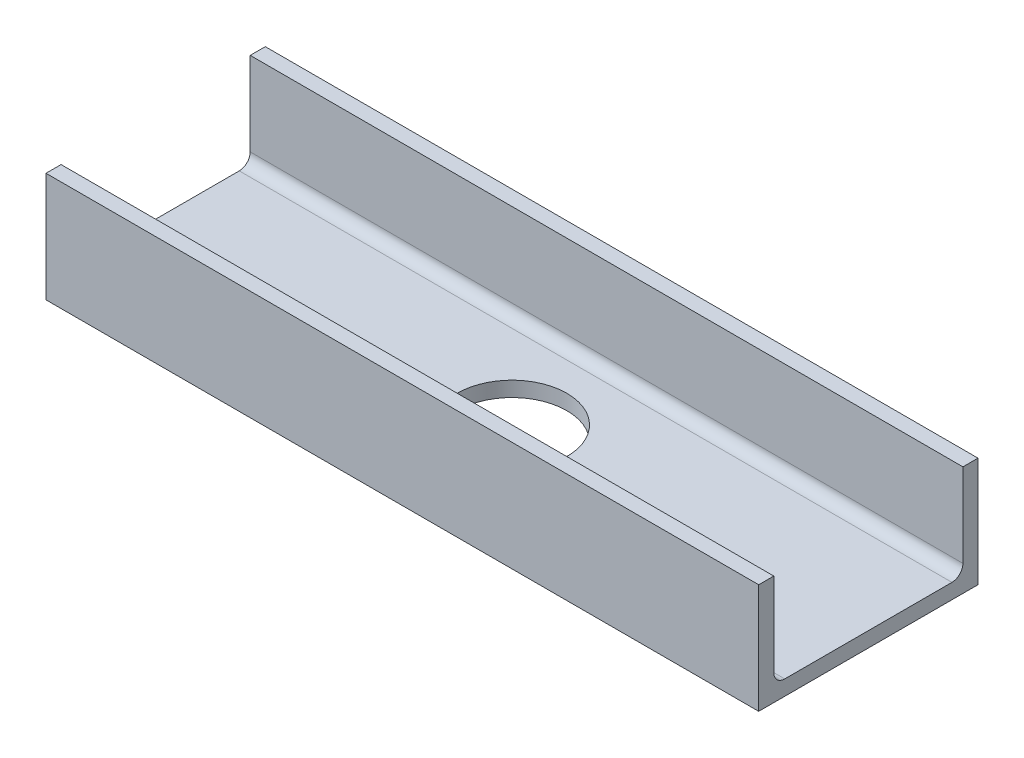
ISO-10303-21;
HEADER;
FILE_DESCRIPTION(('STEP AP214'),'2;1');
FILE_NAME('part.step','',(''),(''),'','','');
FILE_SCHEMA(('AUTOMOTIVE_DESIGN { 1 0 10303 214 1 1 1 1 }'));
ENDSEC;
DATA;
#1=APPLICATION_CONTEXT('core data for automotive mechanical design processes');
#2=APPLICATION_PROTOCOL_DEFINITION('international standard','automotive_design',2000,#1);
#3=PRODUCT_CONTEXT('',#1,'mechanical');
#4=PRODUCT('Part','Part','',(#3));
#5=PRODUCT_RELATED_PRODUCT_CATEGORY('part','',(#4));
#6=PRODUCT_DEFINITION_FORMATION('','',#4);
#7=PRODUCT_DEFINITION_CONTEXT('part definition',#1,'design');
#8=PRODUCT_DEFINITION('design','',#6,#7);
#9=PRODUCT_DEFINITION_SHAPE('','',#8);
#10=(LENGTH_UNIT() NAMED_UNIT(*) SI_UNIT(.MILLI.,.METRE.));
#11=(NAMED_UNIT(*) PLANE_ANGLE_UNIT() SI_UNIT($,.RADIAN.));
#12=(NAMED_UNIT(*) SI_UNIT($,.STERADIAN.) SOLID_ANGLE_UNIT());
#13=UNCERTAINTY_MEASURE_WITH_UNIT(LENGTH_MEASURE(1.E-05),#10,'distance_accuracy_value','');
#14=(GEOMETRIC_REPRESENTATION_CONTEXT(3) GLOBAL_UNCERTAINTY_ASSIGNED_CONTEXT((#13)) GLOBAL_UNIT_ASSIGNED_CONTEXT((#10,
#11,#12)) REPRESENTATION_CONTEXT('',''));
#15=CARTESIAN_POINT('',(0.,0.,0.));
#16=DIRECTION('',(0.,0.,1.));
#17=DIRECTION('',(1.,0.,0.));
#18=AXIS2_PLACEMENT_3D('',#15,#16,#17);
#19=CARTESIAN_POINT('',(-165.1,-9.2075,0.));
#20=DIRECTION('',(0.,-1.,0.));
#21=DIRECTION('',(0.,0.,-1.));
#22=AXIS2_PLACEMENT_3D('',#19,#20,#21);
#23=PLANE('',#22);
#24=CARTESIAN_POINT('',(-82.55,-9.2075,-4.07997203730193E-11));
#25=DIRECTION('',(0.,-1.,0.));
#26=DIRECTION('',(0.,0.,-1.));
#27=AXIS2_PLACEMENT_3D('',#24,#25,#26);
#28=CIRCLE('',#27,12.7);
#29=CARTESIAN_POINT('',(-82.55,-9.2075,-12.7000000000408));
#30=VERTEX_POINT('',#29);
#31=EDGE_CURVE('E160',#30,#30,#28,.T.);
#32=ORIENTED_EDGE('',*,*,#31,.T.);
#33=EDGE_LOOP('',(#32));
#34=FACE_BOUND('',#33,.T.);
#35=DIRECTION('',(0.,0.,-1.));
#36=VECTOR('',#35,1.);
#37=CARTESIAN_POINT('',(0.,-9.2075,0.));
#38=LINE('',#37,#36);
#39=CARTESIAN_POINT('',(0.,-9.2075,19.3675));
#40=VERTEX_POINT('',#39);
#41=CARTESIAN_POINT('',(0.,-9.2075,-19.3675));
#42=VERTEX_POINT('',#41);
#43=EDGE_CURVE('E163',#40,#42,#38,.T.);
#44=ORIENTED_EDGE('',*,*,#43,.T.);
#45=DIRECTION('',(1.,0.,0.));
#46=VECTOR('',#45,1.);
#47=CARTESIAN_POINT('',(-165.1,-9.2075,-19.3675));
#48=LINE('',#47,#46);
#49=CARTESIAN_POINT('',(-165.1,-9.2075,-19.3675));
#50=VERTEX_POINT('',#49);
#51=EDGE_CURVE('E11',#50,#42,#48,.T.);
#52=ORIENTED_EDGE('',*,*,#51,.F.);
#53=DIRECTION('',(0.,0.,-1.));
#54=VECTOR('',#53,1.);
#55=CARTESIAN_POINT('',(-165.1,-9.2075,0.));
#56=LINE('',#55,#54);
#57=CARTESIAN_POINT('',(-165.1,-9.2075,19.3675));
#58=VERTEX_POINT('',#57);
#59=EDGE_CURVE('E57',#58,#50,#56,.T.);
#60=ORIENTED_EDGE('',*,*,#59,.F.);
#61=DIRECTION('',(1.,0.,0.));
#62=VECTOR('',#61,1.);
#63=CARTESIAN_POINT('',(-165.1,-9.2075,19.3675));
#64=LINE('',#63,#62);
#65=EDGE_CURVE('E42',#58,#40,#64,.T.);
#66=ORIENTED_EDGE('',*,*,#65,.T.);
#67=EDGE_LOOP('',(#44,#52,#60,#66));
#68=FACE_BOUND('',#67,.T.);
#69=ADVANCED_FACE('F39',(#34,#68),#23,.F.);
#70=CARTESIAN_POINT('',(-165.1,-6.6675,-19.3675));
#71=DIRECTION('',(1.,0.,0.));
#72=DIRECTION('',(0.,0.,-1.));
#73=AXIS2_PLACEMENT_3D('',#70,#71,#72);
#74=CYLINDRICAL_SURFACE('',#73,2.54);
#75=CARTESIAN_POINT('',(0.,-6.6675,-19.3675));
#76=DIRECTION('',(1.,0.,0.));
#77=DIRECTION('',(0.,0.,-1.));
#78=AXIS2_PLACEMENT_3D('',#75,#76,#77);
#79=CIRCLE('',#78,2.54);
#80=CARTESIAN_POINT('',(0.,-6.6675,-21.9075));
#81=VERTEX_POINT('',#80);
#82=EDGE_CURVE('E159',#81,#42,#79,.F.);
#83=ORIENTED_EDGE('',*,*,#82,.F.);
#84=DIRECTION('',(1.,0.,0.));
#85=VECTOR('',#84,1.);
#86=CARTESIAN_POINT('',(-165.1,-6.6675,-21.9075));
#87=LINE('',#86,#85);
#88=CARTESIAN_POINT('',(-165.1,-6.6675,-21.9075));
#89=VERTEX_POINT('',#88);
#90=EDGE_CURVE('E48',#89,#81,#87,.T.);
#91=ORIENTED_EDGE('',*,*,#90,.F.);
#92=CARTESIAN_POINT('',(-165.1,-6.6675,-19.3675));
#93=DIRECTION('',(1.,0.,0.));
#94=DIRECTION('',(0.,0.,-1.));
#95=AXIS2_PLACEMENT_3D('',#92,#93,#94);
#96=CIRCLE('',#95,2.54);
#97=EDGE_CURVE('E128',#89,#50,#96,.F.);
#98=ORIENTED_EDGE('',*,*,#97,.T.);
#99=ORIENTED_EDGE('',*,*,#51,.T.);
#100=EDGE_LOOP('',(#83,#91,#98,#99));
#101=FACE_BOUND('',#100,.T.);
#102=ADVANCED_FACE('F240',(#101),#74,.F.);
#103=CARTESIAN_POINT('',(-165.1,0.,-21.9075));
#104=DIRECTION('',(0.,0.,-1.));
#105=DIRECTION('',(-1.,0.,0.));
#106=AXIS2_PLACEMENT_3D('',#103,#104,#105);
#107=PLANE('',#106);
#108=DIRECTION('',(0.,1.,0.));
#109=VECTOR('',#108,1.);
#110=CARTESIAN_POINT('',(0.,0.,-21.9075));
#111=LINE('',#110,#109);
#112=CARTESIAN_POINT('',(0.,12.7,-21.9075));
#113=VERTEX_POINT('',#112);
#114=EDGE_CURVE('E133',#81,#113,#111,.T.);
#115=ORIENTED_EDGE('',*,*,#114,.T.);
#116=DIRECTION('',(1.,0.,0.));
#117=VECTOR('',#116,1.);
#118=CARTESIAN_POINT('',(-165.1,12.7,-21.9075));
#119=LINE('',#118,#117);
#120=CARTESIAN_POINT('',(-165.1,12.7,-21.9075));
#121=VERTEX_POINT('',#120);
#122=EDGE_CURVE('E131',#121,#113,#119,.T.);
#123=ORIENTED_EDGE('',*,*,#122,.F.);
#124=DIRECTION('',(0.,1.,0.));
#125=VECTOR('',#124,1.);
#126=CARTESIAN_POINT('',(-165.1,0.,-21.9075));
#127=LINE('',#126,#125);
#128=EDGE_CURVE('E121',#89,#121,#127,.T.);
#129=ORIENTED_EDGE('',*,*,#128,.F.);
#130=ORIENTED_EDGE('',*,*,#90,.T.);
#131=EDGE_LOOP('',(#115,#123,#129,#130));
#132=FACE_BOUND('',#131,.T.);
#133=ADVANCED_FACE('F132',(#132),#107,.F.);
#134=CARTESIAN_POINT('',(-165.1,12.7,0.));
#135=DIRECTION('',(0.,-1.,0.));
#136=DIRECTION('',(0.,0.,-1.));
#137=AXIS2_PLACEMENT_3D('',#134,#135,#136);
#138=PLANE('',#137);
#139=DIRECTION('',(0.,0.,-1.));
#140=VECTOR('',#139,1.);
#141=CARTESIAN_POINT('',(0.,12.7,0.));
#142=LINE('',#141,#140);
#143=CARTESIAN_POINT('',(0.,12.7,-25.4));
#144=VERTEX_POINT('',#143);
#145=EDGE_CURVE('E191',#113,#144,#142,.T.);
#146=ORIENTED_EDGE('',*,*,#145,.T.);
#147=DIRECTION('',(1.,0.,0.));
#148=VECTOR('',#147,1.);
#149=CARTESIAN_POINT('',(-165.1,12.7,-25.4));
#150=LINE('',#149,#148);
#151=CARTESIAN_POINT('',(-165.1,12.7,-25.4));
#152=VERTEX_POINT('',#151);
#153=EDGE_CURVE('E137',#152,#144,#150,.T.);
#154=ORIENTED_EDGE('',*,*,#153,.F.);
#155=DIRECTION('',(0.,0.,-1.));
#156=VECTOR('',#155,1.);
#157=CARTESIAN_POINT('',(-165.1,12.7,0.));
#158=LINE('',#157,#156);
#159=EDGE_CURVE('E126',#121,#152,#158,.T.);
#160=ORIENTED_EDGE('',*,*,#159,.F.);
#161=ORIENTED_EDGE('',*,*,#122,.T.);
#162=EDGE_LOOP('',(#146,#154,#160,#161));
#163=FACE_BOUND('',#162,.T.);
#164=ADVANCED_FACE('F139',(#163),#138,.F.);
#165=CARTESIAN_POINT('',(-165.1,0.,-25.4));
#166=DIRECTION('',(0.,0.,-1.));
#167=DIRECTION('',(-1.,0.,0.));
#168=AXIS2_PLACEMENT_3D('',#165,#166,#167);
#169=PLANE('',#168);
#170=DIRECTION('',(0.,1.,0.));
#171=VECTOR('',#170,1.);
#172=CARTESIAN_POINT('',(0.,0.,-25.4));
#173=LINE('',#172,#171);
#174=CARTESIAN_POINT('',(0.,-12.7,-25.4));
#175=VERTEX_POINT('',#174);
#176=EDGE_CURVE('E188',#175,#144,#173,.T.);
#177=ORIENTED_EDGE('',*,*,#176,.F.);
#178=DIRECTION('',(1.,0.,0.));
#179=VECTOR('',#178,1.);
#180=CARTESIAN_POINT('',(-165.1,-12.7,-25.4));
#181=LINE('',#180,#179);
#182=CARTESIAN_POINT('',(-165.1,-12.7,-25.4));
#183=VERTEX_POINT('',#182);
#184=EDGE_CURVE('E183',#183,#175,#181,.T.);
#185=ORIENTED_EDGE('',*,*,#184,.F.);
#186=DIRECTION('',(0.,1.,0.));
#187=VECTOR('',#186,1.);
#188=CARTESIAN_POINT('',(-165.1,0.,-25.4));
#189=LINE('',#188,#187);
#190=EDGE_CURVE('E141',#183,#152,#189,.T.);
#191=ORIENTED_EDGE('',*,*,#190,.T.);
#192=ORIENTED_EDGE('',*,*,#153,.T.);
#193=EDGE_LOOP('',(#177,#185,#191,#192));
#194=FACE_BOUND('',#193,.T.);
#195=ADVANCED_FACE('F175',(#194),#169,.T.);
#196=CARTESIAN_POINT('',(-165.1,-12.7,0.));
#197=DIRECTION('',(0.,-1.,0.));
#198=DIRECTION('',(0.,0.,-1.));
#199=AXIS2_PLACEMENT_3D('',#196,#197,#198);
#200=PLANE('',#199);
#201=CARTESIAN_POINT('',(-82.55,-12.7,-4.07997203730193E-11));
#202=DIRECTION('',(0.,-1.,0.));
#203=DIRECTION('',(0.,0.,-1.));
#204=AXIS2_PLACEMENT_3D('',#201,#202,#203);
#205=CIRCLE('',#204,12.7);
#206=CARTESIAN_POINT('',(-82.55,-12.7,-12.7000000000408));
#207=VERTEX_POINT('',#206);
#208=EDGE_CURVE('E164',#207,#207,#205,.T.);
#209=ORIENTED_EDGE('',*,*,#208,.F.);
#210=EDGE_LOOP('',(#209));
#211=FACE_BOUND('',#210,.T.);
#212=DIRECTION('',(0.,0.,-1.));
#213=VECTOR('',#212,1.);
#214=CARTESIAN_POINT('',(0.,-12.7,0.));
#215=LINE('',#214,#213);
#216=CARTESIAN_POINT('',(0.,-12.7,25.4));
#217=VERTEX_POINT('',#216);
#218=EDGE_CURVE('E179',#217,#175,#215,.T.);
#219=ORIENTED_EDGE('',*,*,#218,.F.);
#220=DIRECTION('',(1.,0.,0.));
#221=VECTOR('',#220,1.);
#222=CARTESIAN_POINT('',(-165.1,-12.7,25.4));
#223=LINE('',#222,#221);
#224=CARTESIAN_POINT('',(-165.1,-12.7,25.4));
#225=VERTEX_POINT('',#224);
#226=EDGE_CURVE('E181',#225,#217,#223,.T.);
#227=ORIENTED_EDGE('',*,*,#226,.F.);
#228=DIRECTION('',(0.,0.,-1.));
#229=VECTOR('',#228,1.);
#230=CARTESIAN_POINT('',(-165.1,-12.7,0.));
#231=LINE('',#230,#229);
#232=EDGE_CURVE('E144',#225,#183,#231,.T.);
#233=ORIENTED_EDGE('',*,*,#232,.T.);
#234=ORIENTED_EDGE('',*,*,#184,.T.);
#235=EDGE_LOOP('',(#219,#227,#233,#234));
#236=FACE_BOUND('',#235,.T.);
#237=ADVANCED_FACE('F171',(#211,#236),#200,.T.);
#238=CARTESIAN_POINT('',(-165.1,0.,25.4));
#239=DIRECTION('',(0.,0.,-1.));
#240=DIRECTION('',(-1.,0.,0.));
#241=AXIS2_PLACEMENT_3D('',#238,#239,#240);
#242=PLANE('',#241);
#243=DIRECTION('',(0.,1.,0.));
#244=VECTOR('',#243,1.);
#245=CARTESIAN_POINT('',(0.,0.,25.4));
#246=LINE('',#245,#244);
#247=CARTESIAN_POINT('',(0.,12.7,25.4));
#248=VERTEX_POINT('',#247);
#249=EDGE_CURVE('E189',#217,#248,#246,.T.);
#250=ORIENTED_EDGE('',*,*,#249,.T.);
#251=DIRECTION('',(1.,0.,0.));
#252=VECTOR('',#251,1.);
#253=CARTESIAN_POINT('',(-165.1,12.7,25.4));
#254=LINE('',#253,#252);
#255=CARTESIAN_POINT('',(-165.1,12.7,25.4));
#256=VERTEX_POINT('',#255);
#257=EDGE_CURVE('E204',#256,#248,#254,.T.);
#258=ORIENTED_EDGE('',*,*,#257,.F.);
#259=DIRECTION('',(0.,1.,0.));
#260=VECTOR('',#259,1.);
#261=CARTESIAN_POINT('',(-165.1,0.,25.4));
#262=LINE('',#261,#260);
#263=EDGE_CURVE('E148',#225,#256,#262,.T.);
#264=ORIENTED_EDGE('',*,*,#263,.F.);
#265=ORIENTED_EDGE('',*,*,#226,.T.);
#266=EDGE_LOOP('',(#250,#258,#264,#265));
#267=FACE_BOUND('',#266,.T.);
#268=ADVANCED_FACE('F174',(#267),#242,.F.);
#269=CARTESIAN_POINT('',(0.,12.7,21.9075));
#270=VERTEX_POINT('',#269);
#271=EDGE_CURVE('E193',#248,#270,#142,.T.);
#272=ORIENTED_EDGE('',*,*,#271,.T.);
#273=DIRECTION('',(1.,0.,0.));
#274=VECTOR('',#273,1.);
#275=CARTESIAN_POINT('',(-165.1,12.7,21.9075));
#276=LINE('',#275,#274);
#277=CARTESIAN_POINT('',(-165.1,12.7,21.9075));
#278=VERTEX_POINT('',#277);
#279=EDGE_CURVE('E207',#278,#270,#276,.T.);
#280=ORIENTED_EDGE('',*,*,#279,.F.);
#281=EDGE_CURVE('E143',#256,#278,#158,.T.);
#282=ORIENTED_EDGE('',*,*,#281,.F.);
#283=ORIENTED_EDGE('',*,*,#257,.T.);
#284=EDGE_LOOP('',(#272,#280,#282,#283));
#285=FACE_BOUND('',#284,.T.);
#286=ADVANCED_FACE('F229',(#285),#138,.F.);
#287=CARTESIAN_POINT('',(-165.1,0.,21.9075));
#288=DIRECTION('',(0.,0.,-1.));
#289=DIRECTION('',(0.,1.,0.));
#290=AXIS2_PLACEMENT_3D('',#287,#288,#289);
#291=PLANE('',#290);
#292=DIRECTION('',(0.,1.,0.));
#293=VECTOR('',#292,1.);
#294=CARTESIAN_POINT('',(0.,0.,21.9075));
#295=LINE('',#294,#293);
#296=CARTESIAN_POINT('',(0.,-6.6675,21.9075));
#297=VERTEX_POINT('',#296);
#298=EDGE_CURVE('E218',#297,#270,#295,.T.);
#299=ORIENTED_EDGE('',*,*,#298,.F.);
#300=DIRECTION('',(1.,0.,0.));
#301=VECTOR('',#300,1.);
#302=CARTESIAN_POINT('',(-165.1,-6.6675,21.9075));
#303=LINE('',#302,#301);
#304=CARTESIAN_POINT('',(-165.1,-6.6675,21.9075));
#305=VERTEX_POINT('',#304);
#306=EDGE_CURVE('E208',#305,#297,#303,.T.);
#307=ORIENTED_EDGE('',*,*,#306,.F.);
#308=DIRECTION('',(0.,1.,0.));
#309=VECTOR('',#308,1.);
#310=CARTESIAN_POINT('',(-165.1,0.,21.9075));
#311=LINE('',#310,#309);
#312=EDGE_CURVE('E149',#305,#278,#311,.T.);
#313=ORIENTED_EDGE('',*,*,#312,.T.);
#314=ORIENTED_EDGE('',*,*,#279,.T.);
#315=EDGE_LOOP('',(#299,#307,#313,#314));
#316=FACE_BOUND('',#315,.T.);
#317=ADVANCED_FACE('F230',(#316),#291,.T.);
#318=CARTESIAN_POINT('',(-165.1,-6.6675,19.3675));
#319=DIRECTION('',(1.,0.,0.));
#320=DIRECTION('',(0.,0.,-1.));
#321=AXIS2_PLACEMENT_3D('',#318,#319,#320);
#322=CYLINDRICAL_SURFACE('',#321,2.54);
#323=CARTESIAN_POINT('',(0.,-6.6675,19.3675));
#324=DIRECTION('',(1.,0.,0.));
#325=DIRECTION('',(0.,0.,-1.));
#326=AXIS2_PLACEMENT_3D('',#323,#324,#325);
#327=CIRCLE('',#326,2.54);
#328=EDGE_CURVE('E215',#40,#297,#327,.F.);
#329=ORIENTED_EDGE('',*,*,#328,.F.);
#330=ORIENTED_EDGE('',*,*,#65,.F.);
#331=CARTESIAN_POINT('',(-165.1,-6.6675,19.3675));
#332=DIRECTION('',(1.,0.,0.));
#333=DIRECTION('',(0.,0.,-1.));
#334=AXIS2_PLACEMENT_3D('',#331,#332,#333);
#335=CIRCLE('',#334,2.54);
#336=EDGE_CURVE('E154',#58,#305,#335,.F.);
#337=ORIENTED_EDGE('',*,*,#336,.T.);
#338=ORIENTED_EDGE('',*,*,#306,.T.);
#339=EDGE_LOOP('',(#329,#330,#337,#338));
#340=FACE_BOUND('',#339,.T.);
#341=ADVANCED_FACE('F231',(#340),#322,.F.);
#342=CARTESIAN_POINT('',(-165.1,0.,0.));
#343=DIRECTION('',(1.,0.,0.));
#344=DIRECTION('',(0.,0.,-1.));
#345=AXIS2_PLACEMENT_3D('',#342,#343,#344);
#346=PLANE('',#345);
#347=ORIENTED_EDGE('',*,*,#59,.T.);
#348=ORIENTED_EDGE('',*,*,#97,.F.);
#349=ORIENTED_EDGE('',*,*,#128,.T.);
#350=ORIENTED_EDGE('',*,*,#159,.T.);
#351=ORIENTED_EDGE('',*,*,#190,.F.);
#352=ORIENTED_EDGE('',*,*,#232,.F.);
#353=ORIENTED_EDGE('',*,*,#263,.T.);
#354=ORIENTED_EDGE('',*,*,#281,.T.);
#355=ORIENTED_EDGE('',*,*,#312,.F.);
#356=ORIENTED_EDGE('',*,*,#336,.F.);
#357=EDGE_LOOP('',(#347,#348,#349,#350,#351,#352,#353,#354,#355,#356));
#358=FACE_BOUND('',#357,.T.);
#359=ADVANCED_FACE('F123',(#358),#346,.F.);
#360=CARTESIAN_POINT('',(0.,0.,0.));
#361=DIRECTION('',(1.,0.,0.));
#362=DIRECTION('',(0.,0.,-1.));
#363=AXIS2_PLACEMENT_3D('',#360,#361,#362);
#364=PLANE('',#363);
#365=ORIENTED_EDGE('',*,*,#43,.F.);
#366=ORIENTED_EDGE('',*,*,#328,.T.);
#367=ORIENTED_EDGE('',*,*,#298,.T.);
#368=ORIENTED_EDGE('',*,*,#271,.F.);
#369=ORIENTED_EDGE('',*,*,#249,.F.);
#370=ORIENTED_EDGE('',*,*,#218,.T.);
#371=ORIENTED_EDGE('',*,*,#176,.T.);
#372=ORIENTED_EDGE('',*,*,#145,.F.);
#373=ORIENTED_EDGE('',*,*,#114,.F.);
#374=ORIENTED_EDGE('',*,*,#82,.T.);
#375=EDGE_LOOP('',(#365,#366,#367,#368,#369,#370,#371,#372,#373,#374));
#376=FACE_BOUND('',#375,.T.);
#377=ADVANCED_FACE('F223',(#376),#364,.T.);
#378=CARTESIAN_POINT('',(-82.55,-0.762000000000001,-4.07997203730193E-11));
#379=DIRECTION('',(0.,-1.,0.));
#380=DIRECTION('',(0.,0.,-1.));
#381=AXIS2_PLACEMENT_3D('',#378,#379,#380);
#382=CYLINDRICAL_SURFACE('',#381,12.7);
#383=ORIENTED_EDGE('',*,*,#208,.T.);
#384=EDGE_LOOP('',(#383));
#385=FACE_BOUND('',#384,.T.);
#386=ORIENTED_EDGE('',*,*,#31,.F.);
#387=EDGE_LOOP('',(#386));
#388=FACE_BOUND('',#387,.T.);
#389=ADVANCED_FACE('F168',(#385,#388),#382,.F.);
#390=CLOSED_SHELL('',(#69,#102,#133,#164,#195,#237,#268,#286,#317,#341,#359,#377,#389));
#391=MANIFOLD_SOLID_BREP('B2',#390);
#392=ADVANCED_BREP_SHAPE_REPRESENTATION('',(#18,#391),#14);
#393=SHAPE_DEFINITION_REPRESENTATION(#9,#392);
ENDSEC;
END-ISO-10303-21;
